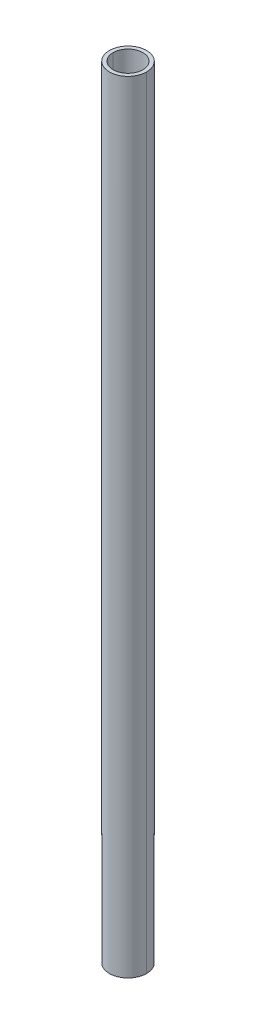
ISO-10303-21;
HEADER;
FILE_DESCRIPTION(('STEP AP214'),'2;1');
FILE_NAME('part.step','',(''),(''),'','','');
FILE_SCHEMA(('AUTOMOTIVE_DESIGN { 1 0 10303 214 1 1 1 1 }'));
ENDSEC;
DATA;
#1=APPLICATION_CONTEXT('core data for automotive mechanical design processes');
#2=APPLICATION_PROTOCOL_DEFINITION('international standard','automotive_design',2000,#1);
#3=PRODUCT_CONTEXT('',#1,'mechanical');
#4=PRODUCT('Part','Part','',(#3));
#5=PRODUCT_RELATED_PRODUCT_CATEGORY('part','',(#4));
#6=PRODUCT_DEFINITION_FORMATION('','',#4);
#7=PRODUCT_DEFINITION_CONTEXT('part definition',#1,'design');
#8=PRODUCT_DEFINITION('design','',#6,#7);
#9=PRODUCT_DEFINITION_SHAPE('','',#8);
#10=(LENGTH_UNIT() NAMED_UNIT(*) SI_UNIT(.MILLI.,.METRE.));
#11=(NAMED_UNIT(*) PLANE_ANGLE_UNIT() SI_UNIT($,.RADIAN.));
#12=(NAMED_UNIT(*) SI_UNIT($,.STERADIAN.) SOLID_ANGLE_UNIT());
#13=UNCERTAINTY_MEASURE_WITH_UNIT(LENGTH_MEASURE(1.E-05),#10,'distance_accuracy_value','');
#14=(GEOMETRIC_REPRESENTATION_CONTEXT(3) GLOBAL_UNCERTAINTY_ASSIGNED_CONTEXT((#13)) GLOBAL_UNIT_ASSIGNED_CONTEXT((#10,
#11,#12)) REPRESENTATION_CONTEXT('',''));
#15=CARTESIAN_POINT('',(0.,0.,0.));
#16=DIRECTION('',(0.,0.,1.));
#17=DIRECTION('',(1.,0.,0.));
#18=AXIS2_PLACEMENT_3D('',#15,#16,#17);
#19=CARTESIAN_POINT('',(0.,124.5,0.));
#20=DIRECTION('',(0.,-1.,0.));
#21=DIRECTION('',(-1.,0.,0.));
#22=AXIS2_PLACEMENT_3D('',#19,#20,#21);
#23=CYLINDRICAL_SURFACE('',#22,5.);
#24=CARTESIAN_POINT('',(5.,-85.5,0.));
#25=DIRECTION('',(0.,1.,0.));
#26=VECTOR('',#25,1.);
#27=LINE('',#24,#26);
#28=CARTESIAN_POINT('',(5.,-85.5,0.));
#29=VERTEX_POINT('',#28);
#30=CARTESIAN_POINT('',(5.,124.5,0.));
#31=VERTEX_POINT('',#30);
#32=EDGE_CURVE('E170',#29,#31,#27,.T.);
#33=ORIENTED_EDGE('',*,*,#32,.F.);
#34=CARTESIAN_POINT('',(0.,-85.5,0.));
#35=DIRECTION('',(0.,-1.,0.));
#36=DIRECTION('',(0.,0.,-1.));
#37=AXIS2_PLACEMENT_3D('',#34,#35,#36);
#38=CIRCLE('',#37,5.);
#39=CARTESIAN_POINT('',(-5.,-85.5,-1.12989546859166E-13));
#40=VERTEX_POINT('',#39);
#41=EDGE_CURVE('E78',#29,#40,#38,.F.);
#42=ORIENTED_EDGE('',*,*,#41,.T.);
#43=CARTESIAN_POINT('',(-5.,124.5,0.));
#44=DIRECTION('',(0.,-1.,0.));
#45=VECTOR('',#44,1.);
#46=LINE('',#43,#45);
#47=CARTESIAN_POINT('',(-5.,124.5,0.));
#48=VERTEX_POINT('',#47);
#49=EDGE_CURVE('E200',#48,#40,#46,.T.);
#50=ORIENTED_EDGE('',*,*,#49,.F.);
#51=CARTESIAN_POINT('',(5.,124.5,0.));
#52=CARTESIAN_POINT('',(5.,124.5,-0.492179195495219));
#53=CARTESIAN_POINT('',(4.90392640201615,124.5,-0.975451610080696));
#54=CARTESIAN_POINT('',(4.80801317493825,124.5,-1.45791732192399));
#55=CARTESIAN_POINT('',(4.61939766255643,124.5,-1.91341716182551));
#56=CARTESIAN_POINT('',(4.43120299015771,124.5,-2.36790068794402));
#57=CARTESIAN_POINT('',(4.15734806151272,124.5,-2.77785116509807));
#58=CARTESIAN_POINT('',(3.88410415951258,124.5,-3.18688695846007));
#59=CARTESIAN_POINT('',(3.53553390593274,124.5,-3.5355339059328));
#60=CARTESIAN_POINT('',(3.18774138424905,124.5,-3.88340295038953));
#61=CARTESIAN_POINT('',(2.77785116509801,124.5,-4.15734806151278));
#62=CARTESIAN_POINT('',(2.36887549529244,124.5,-4.43068194477462));
#63=CARTESIAN_POINT('',(1.91341716182545,124.5,-4.61939766255649));
#64=CARTESIAN_POINT('',(1.45897504953384,124.5,-4.8076923167757));
#65=CARTESIAN_POINT('',(0.975451610080642,124.5,-4.90392640201621));
#66=CARTESIAN_POINT('',(0.493007010823137,124.5,-4.99994576922884));
#67=CARTESIAN_POINT('',(0.,124.5,-5.00000000000006));
#68=CARTESIAN_POINT('',(-0.491907010833301,124.5,-5.00005410977128));
#69=CARTESIAN_POINT('',(-0.975451610080641,124.5,-4.90392640201621));
#70=CARTESIAN_POINT('',(-1.45791732192544,124.5,-4.80801317493799));
#71=CARTESIAN_POINT('',(-1.91341716182545,124.5,-4.61939766255649));
#72=CARTESIAN_POINT('',(-2.36790068794516,124.5,-4.43120299015696));
#73=CARTESIAN_POINT('',(-2.77785116509801,124.5,-4.15734806151278));
#74=CARTESIAN_POINT('',(-3.18688695846117,124.5,-3.88410415951186));
#75=CARTESIAN_POINT('',(-3.53553390593274,124.5,-3.5355339059328));
#76=CARTESIAN_POINT('',(-3.88340295039066,124.5,-3.18774138424753));
#77=CARTESIAN_POINT('',(-4.15734806151272,124.5,-2.77785116509807));
#78=CARTESIAN_POINT('',(-4.43068194477426,124.5,-2.36887549529275));
#79=CARTESIAN_POINT('',(-4.61939766255643,124.5,-1.91341716182551));
#80=CARTESIAN_POINT('',(-4.80769231677526,124.5,-1.45897504953529));
#81=CARTESIAN_POINT('',(-4.90392640201615,124.5,-0.975451610080698));
#82=CARTESIAN_POINT('',(-5.,124.5,-0.492734530974623));
#83=CARTESIAN_POINT('',(-5.,124.5,0.));
#84=B_SPLINE_CURVE_WITH_KNOTS('',2,(#51,#52,#53,#54,#55,#56,#57,#58,#59,#60,#61,#62,#63,#64,#65,
#66,#67,#68,#69,#70,#71,#72,#73,#74,#75,#76,#77,#78,#79,#80,#81,#82,#83),.UNSPECIFIED.,.F.,.F.,
(3,2,2,2,2,2,2,2,2,2,2,2,2,2,2,2,3),(0.,0.0625,0.125,0.1875,0.25,0.3125,0.375,0.4375,0.5,0.5625,
0.625,0.6875,0.75,0.8125,0.875,0.9375,1.),.UNSPECIFIED.);
#85=EDGE_CURVE('E122',#31,#48,#84,.T.);
#86=ORIENTED_EDGE('',*,*,#85,.F.);
#87=EDGE_LOOP('',(#33,#42,#50,#86));
#88=FACE_BOUND('',#87,.T.);
#89=ADVANCED_FACE('F60',(#88),#23,.T.);
#90=CARTESIAN_POINT('',(0.,124.5,0.));
#91=DIRECTION('',(0.,-1.,0.));
#92=DIRECTION('',(-1.,0.,0.));
#93=AXIS2_PLACEMENT_3D('',#90,#91,#92);
#94=CYLINDRICAL_SURFACE('',#93,5.);
#95=ORIENTED_EDGE('',*,*,#49,.T.);
#96=CARTESIAN_POINT('',(0.,-85.5,0.));
#97=DIRECTION('',(0.,-1.,0.));
#98=DIRECTION('',(0.,0.,-1.));
#99=AXIS2_PLACEMENT_3D('',#96,#97,#98);
#100=CIRCLE('',#99,5.);
#101=EDGE_CURVE('E114',#40,#29,#100,.F.);
#102=ORIENTED_EDGE('',*,*,#101,.T.);
#103=ORIENTED_EDGE('',*,*,#32,.T.);
#104=CARTESIAN_POINT('',(-5.,124.5,0.));
#105=CARTESIAN_POINT('',(-5.,124.5,0.492179195493712));
#106=CARTESIAN_POINT('',(-4.90392640201615,124.5,0.975451610080586));
#107=CARTESIAN_POINT('',(-4.80801317493864,124.5,1.45791732192333));
#108=CARTESIAN_POINT('',(-4.61939766255643,124.5,1.91341716182539));
#109=CARTESIAN_POINT('',(-4.43120299015708,124.5,2.36790068794503));
#110=CARTESIAN_POINT('',(-4.15734806151272,124.5,2.77785116509795));
#111=CARTESIAN_POINT('',(-3.88410415951142,124.5,3.1868869584615));
#112=CARTESIAN_POINT('',(-3.53553390593274,124.5,3.53553390593268));
#113=CARTESIAN_POINT('',(-3.18774138424708,124.5,3.88340295039099));
#114=CARTESIAN_POINT('',(-2.77785116509801,124.5,4.15734806151267));
#115=CARTESIAN_POINT('',(-2.36887549529049,124.5,4.43068194477554));
#116=CARTESIAN_POINT('',(-1.91341716182545,124.5,4.61939766255637));
#117=CARTESIAN_POINT('',(-1.45897504953144,124.5,4.80769231677634));
#118=CARTESIAN_POINT('',(-0.975451610080643,124.5,4.9039264020161));
#119=CARTESIAN_POINT('',(-0.493007010821695,124.5,4.99994576922872));
#120=CARTESIAN_POINT('',(0.,124.5,4.99999999999994));
#121=CARTESIAN_POINT('',(0.491907010831871,124.5,5.00005410977117));
#122=CARTESIAN_POINT('',(0.975451610080642,124.5,4.9039264020161));
#123=CARTESIAN_POINT('',(1.45791732192343,124.5,4.80801317493856));
#124=CARTESIAN_POINT('',(1.91341716182545,124.5,4.61939766255637));
#125=CARTESIAN_POINT('',(2.36790068794611,124.5,4.4312029901566));
#126=CARTESIAN_POINT('',(2.77785116509801,124.5,4.15734806151267));
#127=CARTESIAN_POINT('',(3.18688695846293,124.5,3.88410415951019));
#128=CARTESIAN_POINT('',(3.53553390593274,124.5,3.53553390593268));
#129=CARTESIAN_POINT('',(3.88340295039144,124.5,3.18774138424644));
#130=CARTESIAN_POINT('',(4.15734806151272,124.5,2.77785116509795));
#131=CARTESIAN_POINT('',(4.4306819447756,124.5,2.36887549529043));
#132=CARTESIAN_POINT('',(4.61939766255643,124.5,1.91341716182539));
#133=CARTESIAN_POINT('',(4.8076923167764,124.5,1.45897504953139));
#134=CARTESIAN_POINT('',(4.90392640201615,124.5,0.975451610080588));
#135=CARTESIAN_POINT('',(5.,124.5,0.492734530972559));
#136=CARTESIAN_POINT('',(5.,124.5,0.));
#137=B_SPLINE_CURVE_WITH_KNOTS('',2,(#104,#105,#106,#107,#108,#109,#110,#111,#112,#113,#114,
#115,#116,#117,#118,#119,#120,#121,#122,#123,#124,#125,#126,#127,#128,#129,#130,#131,#132,#133,
#134,#135,#136),.UNSPECIFIED.,.F.,.F.,(3,2,2,2,2,2,2,2,2,2,2,2,2,2,2,2,3),(0.,0.0625,0.125,
0.1875,0.25,0.3125,0.375,0.4375,0.5,0.5625,0.625,0.6875,0.75,0.8125,0.875,0.9375,1.),.UNSPECIFIED.);
#138=EDGE_CURVE('E230',#48,#31,#137,.T.);
#139=ORIENTED_EDGE('',*,*,#138,.F.);
#140=EDGE_LOOP('',(#95,#102,#103,#139));
#141=FACE_BOUND('',#140,.T.);
#142=ADVANCED_FACE('F180',(#141),#94,.T.);
#143=CARTESIAN_POINT('',(0.,124.5,0.));
#144=DIRECTION('',(0.,-1.,0.));
#145=DIRECTION('',(-1.,0.,0.));
#146=AXIS2_PLACEMENT_3D('',#143,#144,#145);
#147=CYLINDRICAL_SURFACE('',#146,4.);
#148=CARTESIAN_POINT('',(0.,-85.5,0.));
#149=DIRECTION('',(0.,-1.,0.));
#150=DIRECTION('',(0.,0.,-1.));
#151=AXIS2_PLACEMENT_3D('',#148,#149,#150);
#152=CIRCLE('',#151,4.);
#153=CARTESIAN_POINT('',(-4.,-85.5,-1.07905405700794E-13));
#154=VERTEX_POINT('',#153);
#155=CARTESIAN_POINT('',(4.,-85.5,0.));
#156=VERTEX_POINT('',#155);
#157=EDGE_CURVE('E84',#154,#156,#152,.F.);
#158=ORIENTED_EDGE('',*,*,#157,.F.);
#159=CARTESIAN_POINT('',(-4.,124.5,0.));
#160=DIRECTION('',(0.,-1.,0.));
#161=VECTOR('',#160,1.);
#162=LINE('',#159,#161);
#163=CARTESIAN_POINT('',(-4.,124.5,0.));
#164=VERTEX_POINT('',#163);
#165=EDGE_CURVE('E108',#164,#154,#162,.T.);
#166=ORIENTED_EDGE('',*,*,#165,.F.);
#167=CARTESIAN_POINT('',(4.,124.5,0.));
#168=CARTESIAN_POINT('',(4.,124.5,0.795363493900076));
#169=CARTESIAN_POINT('',(3.69551813004514,124.5,1.5307337294603));
#170=CARTESIAN_POINT('',(3.39134774594879,124.5,2.26535167908255));
#171=CARTESIAN_POINT('',(2.82842712474619,124.5,2.82842712474613));
#172=CARTESIAN_POINT('',(2.26628421404509,124.5,3.39072464600841));
#173=CARTESIAN_POINT('',(1.53073372946036,124.5,3.69551813004509));
#174=CARTESIAN_POINT('',(0.796199454469554,124.5,3.99989052257393));
#175=CARTESIAN_POINT('',(0.,124.5,3.99999999999994));
#176=CARTESIAN_POINT('',(-0.79509945448195,124.5,4.00010932617595));
#177=CARTESIAN_POINT('',(-1.53073372946036,124.5,3.69551813004509));
#178=CARTESIAN_POINT('',(-2.26535167908425,124.5,3.39134774594803));
#179=CARTESIAN_POINT('',(-2.82842712474619,124.5,2.82842712474613));
#180=CARTESIAN_POINT('',(-3.39072464600913,124.5,2.26628421404343));
#181=CARTESIAN_POINT('',(-3.69551813004514,124.5,1.5307337294603));
#182=CARTESIAN_POINT('',(-4.,124.5,0.795935255338052));
#183=CARTESIAN_POINT('',(-4.,124.5,0.));
#184=B_SPLINE_CURVE_WITH_KNOTS('',2,(#167,#168,#169,#170,#171,#172,#173,#174,#175,#176,#177,
#178,#179,#180,#181,#182,#183),.UNSPECIFIED.,.F.,.F.,(3,2,2,2,2,2,2,2,3),(0.,0.125,0.25,0.375,
0.5,0.625,0.75,0.875,1.),.UNSPECIFIED.);
#185=CARTESIAN_POINT('',(4.,124.5,0.));
#186=VERTEX_POINT('',#185);
#187=EDGE_CURVE('E233',#186,#164,#184,.T.);
#188=ORIENTED_EDGE('',*,*,#187,.F.);
#189=CARTESIAN_POINT('',(4.,-85.5,0.));
#190=DIRECTION('',(0.,1.,0.));
#191=VECTOR('',#190,1.);
#192=LINE('',#189,#191);
#193=EDGE_CURVE('E111',#156,#186,#192,.T.);
#194=ORIENTED_EDGE('',*,*,#193,.F.);
#195=EDGE_LOOP('',(#158,#166,#188,#194));
#196=FACE_BOUND('',#195,.T.);
#197=ADVANCED_FACE('F106',(#196),#147,.F.);
#198=CARTESIAN_POINT('',(0.,124.5,0.));
#199=DIRECTION('',(0.,-1.,0.));
#200=DIRECTION('',(-1.,0.,0.));
#201=AXIS2_PLACEMENT_3D('',#198,#199,#200);
#202=CYLINDRICAL_SURFACE('',#201,4.);
#203=CARTESIAN_POINT('',(0.,-85.5,0.));
#204=DIRECTION('',(0.,-1.,0.));
#205=DIRECTION('',(0.,0.,-1.));
#206=AXIS2_PLACEMENT_3D('',#203,#204,#205);
#207=CIRCLE('',#206,4.);
#208=EDGE_CURVE('E11',#156,#154,#207,.F.);
#209=ORIENTED_EDGE('',*,*,#208,.F.);
#210=ORIENTED_EDGE('',*,*,#193,.T.);
#211=CARTESIAN_POINT('',(-4.,124.5,0.));
#212=CARTESIAN_POINT('',(-4.,124.5,-0.795363493900241));
#213=CARTESIAN_POINT('',(-3.69551813004515,124.5,-1.53073372946042));
#214=CARTESIAN_POINT('',(-3.39134774594853,124.5,-2.26535167908324));
#215=CARTESIAN_POINT('',(-2.82842712474619,124.5,-2.82842712474625));
#216=CARTESIAN_POINT('',(-2.26628421404456,124.5,-3.39072464600874));
#217=CARTESIAN_POINT('',(-1.53073372946036,124.5,-3.6955181300452));
#218=CARTESIAN_POINT('',(-0.796199454469554,124.5,-3.99989052257405));
#219=CARTESIAN_POINT('',(0.,124.5,-4.00000000000006));
#220=CARTESIAN_POINT('',(0.795099454482107,124.5,-4.00010932617607));
#221=CARTESIAN_POINT('',(1.53073372946036,124.5,-3.6955181300452));
#222=CARTESIAN_POINT('',(2.26535167908383,124.5,-3.39134774594826));
#223=CARTESIAN_POINT('',(2.82842712474619,124.5,-2.82842712474625));
#224=CARTESIAN_POINT('',(3.39072464600891,124.5,-2.26628421404408));
#225=CARTESIAN_POINT('',(3.69551813004514,124.5,-1.53073372946042));
#226=CARTESIAN_POINT('',(4.,124.5,-0.795935255338163));
#227=CARTESIAN_POINT('',(4.,124.5,0.));
#228=B_SPLINE_CURVE_WITH_KNOTS('',2,(#211,#212,#213,#214,#215,#216,#217,#218,#219,#220,#221,
#222,#223,#224,#225,#226,#227),.UNSPECIFIED.,.F.,.F.,(3,2,2,2,2,2,2,2,3),(0.,0.125,0.25,0.375,
0.5,0.625,0.75,0.875,1.),.UNSPECIFIED.);
#229=EDGE_CURVE('E71',#164,#186,#228,.T.);
#230=ORIENTED_EDGE('',*,*,#229,.F.);
#231=ORIENTED_EDGE('',*,*,#165,.T.);
#232=EDGE_LOOP('',(#209,#210,#230,#231));
#233=FACE_BOUND('',#232,.T.);
#234=ADVANCED_FACE('F117',(#233),#202,.F.);
#235=CARTESIAN_POINT('',(0.,124.5,0.));
#236=DIRECTION('',(0.,1.,0.));
#237=DIRECTION('',(1.,0.,0.));
#238=AXIS2_PLACEMENT_3D('',#235,#236,#237);
#239=PLANE('',#238);
#240=ORIENTED_EDGE('',*,*,#187,.T.);
#241=ORIENTED_EDGE('',*,*,#229,.T.);
#242=EDGE_LOOP('',(#240,#241));
#243=FACE_BOUND('',#242,.T.);
#244=ORIENTED_EDGE('',*,*,#85,.T.);
#245=ORIENTED_EDGE('',*,*,#138,.T.);
#246=EDGE_LOOP('',(#244,#245));
#247=FACE_BOUND('',#246,.T.);
#248=ADVANCED_FACE('F142',(#243,#247),#239,.T.);
#249=CARTESIAN_POINT('',(0.,-85.5,0.));
#250=DIRECTION('',(0.,-1.,0.));
#251=DIRECTION('',(0.,0.,-1.));
#252=AXIS2_PLACEMENT_3D('',#249,#250,#251);
#253=PLANE('',#252);
#254=ORIENTED_EDGE('',*,*,#101,.F.);
#255=ORIENTED_EDGE('',*,*,#41,.F.);
#256=EDGE_LOOP('',(#254,#255));
#257=FACE_BOUND('',#256,.T.);
#258=ORIENTED_EDGE('',*,*,#157,.T.);
#259=ORIENTED_EDGE('',*,*,#208,.T.);
#260=EDGE_LOOP('',(#258,#259));
#261=FACE_BOUND('',#260,.T.);
#262=ADVANCED_FACE('F101',(#257,#261),#253,.T.);
#263=CLOSED_SHELL('',(#89,#142,#197,#234,#248,#262));
#264=MANIFOLD_SOLID_BREP('B2',#263);
#265=ADVANCED_BREP_SHAPE_REPRESENTATION('',(#18,#264),#14);
#266=SHAPE_DEFINITION_REPRESENTATION(#9,#265);
ENDSEC;
END-ISO-10303-21;
